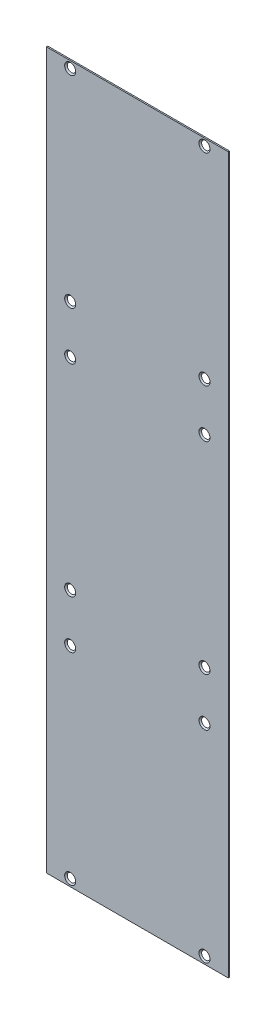
ISO-10303-21;
HEADER;
FILE_DESCRIPTION(('STEP AP214'),'2;1');
FILE_NAME('part.step','',(''),(''),'','','');
FILE_SCHEMA(('AUTOMOTIVE_DESIGN { 1 0 10303 214 1 1 1 1 }'));
ENDSEC;
DATA;
#1=APPLICATION_CONTEXT('core data for automotive mechanical design processes');
#2=APPLICATION_PROTOCOL_DEFINITION('international standard','automotive_design',2000,#1);
#3=PRODUCT_CONTEXT('',#1,'mechanical');
#4=PRODUCT('Part','Part','',(#3));
#5=PRODUCT_RELATED_PRODUCT_CATEGORY('part','',(#4));
#6=PRODUCT_DEFINITION_FORMATION('','',#4);
#7=PRODUCT_DEFINITION_CONTEXT('part definition',#1,'design');
#8=PRODUCT_DEFINITION('design','',#6,#7);
#9=PRODUCT_DEFINITION_SHAPE('','',#8);
#10=(LENGTH_UNIT() NAMED_UNIT(*) SI_UNIT(.MILLI.,.METRE.));
#11=(NAMED_UNIT(*) PLANE_ANGLE_UNIT() SI_UNIT($,.RADIAN.));
#12=(NAMED_UNIT(*) SI_UNIT($,.STERADIAN.) SOLID_ANGLE_UNIT());
#13=UNCERTAINTY_MEASURE_WITH_UNIT(LENGTH_MEASURE(1.E-05),#10,'distance_accuracy_value','');
#14=(GEOMETRIC_REPRESENTATION_CONTEXT(3) GLOBAL_UNCERTAINTY_ASSIGNED_CONTEXT((#13)) GLOBAL_UNIT_ASSIGNED_CONTEXT((#10,
#11,#12)) REPRESENTATION_CONTEXT('',''));
#15=CARTESIAN_POINT('',(0.,0.,0.));
#16=DIRECTION('',(0.,0.,1.));
#17=DIRECTION('',(1.,0.,0.));
#18=AXIS2_PLACEMENT_3D('',#15,#16,#17);
#19=CARTESIAN_POINT('',(0.,0.,0.6));
#20=DIRECTION('',(0.,0.,1.));
#21=DIRECTION('',(1.,0.,0.));
#22=AXIS2_PLACEMENT_3D('',#19,#20,#21);
#23=PLANE('',#22);
#24=CARTESIAN_POINT('',(-101.2,39.8,0.6));
#25=DIRECTION('',(0.,0.,1.));
#26=DIRECTION('',(1.,0.,0.));
#27=AXIS2_PLACEMENT_3D('',#24,#25,#26);
#28=CIRCLE('',#27,2.49996925638162);
#29=CARTESIAN_POINT('',(-98.7000307436184,39.8,0.6));
#30=VERTEX_POINT('',#29);
#31=EDGE_CURVE('E116',#30,#30,#28,.F.);
#32=ORIENTED_EDGE('',*,*,#31,.T.);
#33=EDGE_LOOP('',(#32));
#34=FACE_BOUND('',#33,.T.);
#35=CARTESIAN_POINT('',(-40.2,-187.2,0.6));
#36=DIRECTION('',(0.,0.,1.));
#37=DIRECTION('',(1.,0.,0.));
#38=AXIS2_PLACEMENT_3D('',#35,#36,#37);
#39=CIRCLE('',#38,2.49996925635706);
#40=CARTESIAN_POINT('',(-37.7000307436429,-187.2,0.6));
#41=VERTEX_POINT('',#40);
#42=EDGE_CURVE('E119',#41,#41,#39,.F.);
#43=ORIENTED_EDGE('',*,*,#42,.T.);
#44=EDGE_LOOP('',(#43));
#45=FACE_BOUND('',#44,.T.);
#46=CARTESIAN_POINT('',(-40.2,39.8,0.6));
#47=DIRECTION('',(0.,0.,1.));
#48=DIRECTION('',(1.,0.,0.));
#49=AXIS2_PLACEMENT_3D('',#46,#47,#48);
#50=CIRCLE('',#49,2.49996925638162);
#51=CARTESIAN_POINT('',(-37.7000307436184,39.8,0.6));
#52=VERTEX_POINT('',#51);
#53=EDGE_CURVE('E122',#52,#52,#50,.F.);
#54=ORIENTED_EDGE('',*,*,#53,.T.);
#55=EDGE_LOOP('',(#54));
#56=FACE_BOUND('',#55,.T.);
#57=CARTESIAN_POINT('',(-101.2,-278.8,0.6));
#58=DIRECTION('',(0.,0.,1.));
#59=DIRECTION('',(1.,0.,0.));
#60=AXIS2_PLACEMENT_3D('',#57,#58,#59);
#61=CIRCLE('',#60,2.49996925632834);
#62=CARTESIAN_POINT('',(-98.7000307436717,-278.8,0.6));
#63=VERTEX_POINT('',#62);
#64=EDGE_CURVE('E125',#63,#63,#61,.F.);
#65=ORIENTED_EDGE('',*,*,#64,.T.);
#66=EDGE_LOOP('',(#65));
#67=FACE_BOUND('',#66,.T.);
#68=CARTESIAN_POINT('',(-40.2,-278.8,0.6));
#69=DIRECTION('',(0.,0.,1.));
#70=DIRECTION('',(1.,0.,0.));
#71=AXIS2_PLACEMENT_3D('',#68,#69,#70);
#72=CIRCLE('',#71,2.49996925632834);
#73=CARTESIAN_POINT('',(-37.7000307436717,-278.8,0.6));
#74=VERTEX_POINT('',#73);
#75=EDGE_CURVE('E128',#74,#74,#72,.F.);
#76=ORIENTED_EDGE('',*,*,#75,.T.);
#77=EDGE_LOOP('',(#76));
#78=FACE_BOUND('',#77,.T.);
#79=CARTESIAN_POINT('',(-40.2,-51.8,0.6));
#80=DIRECTION('',(0.,0.,1.));
#81=DIRECTION('',(1.,0.,0.));
#82=AXIS2_PLACEMENT_3D('',#79,#80,#81);
#83=CIRCLE('',#82,2.49996925635288);
#84=CARTESIAN_POINT('',(-37.7000307436471,-51.8,0.6));
#85=VERTEX_POINT('',#84);
#86=EDGE_CURVE('E131',#85,#85,#83,.F.);
#87=ORIENTED_EDGE('',*,*,#86,.T.);
#88=EDGE_LOOP('',(#87));
#89=FACE_BOUND('',#88,.T.);
#90=CARTESIAN_POINT('',(-40.2,-165.3,0.6));
#91=DIRECTION('',(0.,0.,1.));
#92=DIRECTION('',(1.,0.,0.));
#93=AXIS2_PLACEMENT_3D('',#90,#91,#92);
#94=CIRCLE('',#93,2.49996925645429);
#95=CARTESIAN_POINT('',(-37.7000307435457,-165.3,0.6));
#96=VERTEX_POINT('',#95);
#97=EDGE_CURVE('E134',#96,#96,#94,.F.);
#98=ORIENTED_EDGE('',*,*,#97,.T.);
#99=EDGE_LOOP('',(#98));
#100=FACE_BOUND('',#99,.T.);
#101=CARTESIAN_POINT('',(-101.2,-51.8,0.6));
#102=DIRECTION('',(0.,0.,1.));
#103=DIRECTION('',(1.,0.,0.));
#104=AXIS2_PLACEMENT_3D('',#101,#102,#103);
#105=CIRCLE('',#104,2.49996925635288);
#106=CARTESIAN_POINT('',(-98.7000307436471,-51.8,0.6));
#107=VERTEX_POINT('',#106);
#108=EDGE_CURVE('E137',#107,#107,#105,.F.);
#109=ORIENTED_EDGE('',*,*,#108,.T.);
#110=EDGE_LOOP('',(#109));
#111=FACE_BOUND('',#110,.T.);
#112=CARTESIAN_POINT('',(-101.2,-73.7,0.6));
#113=DIRECTION('',(0.,0.,1.));
#114=DIRECTION('',(1.,0.,0.));
#115=AXIS2_PLACEMENT_3D('',#112,#113,#114);
#116=CIRCLE('',#115,2.49996925642619);
#117=CARTESIAN_POINT('',(-98.7000307435738,-73.7,0.6));
#118=VERTEX_POINT('',#117);
#119=EDGE_CURVE('E140',#118,#118,#116,.F.);
#120=ORIENTED_EDGE('',*,*,#119,.T.);
#121=EDGE_LOOP('',(#120));
#122=FACE_BOUND('',#121,.T.);
#123=CARTESIAN_POINT('',(-101.2,-165.3,0.6));
#124=DIRECTION('',(0.,0.,1.));
#125=DIRECTION('',(1.,0.,0.));
#126=AXIS2_PLACEMENT_3D('',#123,#124,#125);
#127=CIRCLE('',#126,2.49996925645429);
#128=CARTESIAN_POINT('',(-98.7000307435457,-165.3,0.6));
#129=VERTEX_POINT('',#128);
#130=EDGE_CURVE('E143',#129,#129,#127,.F.);
#131=ORIENTED_EDGE('',*,*,#130,.T.);
#132=EDGE_LOOP('',(#131));
#133=FACE_BOUND('',#132,.T.);
#134=CARTESIAN_POINT('',(-40.2,-73.7,0.6));
#135=DIRECTION('',(0.,0.,1.));
#136=DIRECTION('',(1.,0.,0.));
#137=AXIS2_PLACEMENT_3D('',#134,#135,#136);
#138=CIRCLE('',#137,2.49996925642619);
#139=CARTESIAN_POINT('',(-37.7000307435738,-73.7,0.6));
#140=VERTEX_POINT('',#139);
#141=EDGE_CURVE('E145',#140,#140,#138,.F.);
#142=ORIENTED_EDGE('',*,*,#141,.T.);
#143=EDGE_LOOP('',(#142));
#144=FACE_BOUND('',#143,.T.);
#145=CARTESIAN_POINT('',(-101.2,-187.2,0.6));
#146=DIRECTION('',(0.,0.,1.));
#147=DIRECTION('',(1.,0.,0.));
#148=AXIS2_PLACEMENT_3D('',#145,#146,#147);
#149=CIRCLE('',#148,2.49996925635706);
#150=CARTESIAN_POINT('',(-98.7000307436429,-187.2,0.6));
#151=VERTEX_POINT('',#150);
#152=EDGE_CURVE('E20',#151,#151,#149,.F.);
#153=ORIENTED_EDGE('',*,*,#152,.T.);
#154=EDGE_LOOP('',(#153));
#155=FACE_BOUND('',#154,.T.);
#156=DIRECTION('',(1.,0.,0.));
#157=VECTOR('',#156,1.);
#158=CARTESIAN_POINT('',(-112.,-282.,0.6));
#159=LINE('',#158,#157);
#160=CARTESIAN_POINT('',(-29.4,-282.,0.6));
#161=VERTEX_POINT('',#160);
#162=CARTESIAN_POINT('',(-112.,-282.,0.6));
#163=VERTEX_POINT('',#162);
#164=EDGE_CURVE('E71',#161,#163,#159,.F.);
#165=ORIENTED_EDGE('',*,*,#164,.F.);
#166=DIRECTION('',(0.,1.,0.));
#167=VECTOR('',#166,1.);
#168=CARTESIAN_POINT('',(-29.4,-282.,0.6));
#169=LINE('',#168,#167);
#170=CARTESIAN_POINT('',(-29.4,43.,0.6));
#171=VERTEX_POINT('',#170);
#172=EDGE_CURVE('E68',#171,#161,#169,.F.);
#173=ORIENTED_EDGE('',*,*,#172,.F.);
#174=DIRECTION('',(1.,0.,0.));
#175=VECTOR('',#174,1.);
#176=CARTESIAN_POINT('',(-29.4,43.,0.6));
#177=LINE('',#176,#175);
#178=CARTESIAN_POINT('',(-112.,43.,0.6));
#179=VERTEX_POINT('',#178);
#180=EDGE_CURVE('E59',#179,#171,#177,.T.);
#181=ORIENTED_EDGE('',*,*,#180,.F.);
#182=DIRECTION('',(0.,1.,0.));
#183=VECTOR('',#182,1.);
#184=CARTESIAN_POINT('',(-112.,43.,0.6));
#185=LINE('',#184,#183);
#186=EDGE_CURVE('E54',#163,#179,#185,.T.);
#187=ORIENTED_EDGE('',*,*,#186,.F.);
#188=EDGE_LOOP('',(#165,#173,#181,#187));
#189=FACE_BOUND('',#188,.T.);
#190=ADVANCED_FACE('F17',(#34,#45,#56,#67,#78,#89,#100,#111,#122,#133,#144,#155,#189),#23,.T.);
#191=CARTESIAN_POINT('',(-29.4,-282.,0.));
#192=DIRECTION('',(1.,0.,0.));
#193=DIRECTION('',(0.,0.,-1.));
#194=AXIS2_PLACEMENT_3D('',#191,#192,#193);
#195=PLANE('',#194);
#196=DIRECTION('',(0.,0.,-1.));
#197=VECTOR('',#196,1.);
#198=CARTESIAN_POINT('',(-29.4,-282.,0.));
#199=LINE('',#198,#197);
#200=CARTESIAN_POINT('',(-29.4,-282.,0.));
#201=VERTEX_POINT('',#200);
#202=EDGE_CURVE('E153',#201,#161,#199,.F.);
#203=ORIENTED_EDGE('',*,*,#202,.F.);
#204=DIRECTION('',(0.,1.,0.));
#205=VECTOR('',#204,1.);
#206=CARTESIAN_POINT('',(-29.4,0.,0.));
#207=LINE('',#206,#205);
#208=CARTESIAN_POINT('',(-29.4,43.,0.));
#209=VERTEX_POINT('',#208);
#210=EDGE_CURVE('E78',#201,#209,#207,.T.);
#211=ORIENTED_EDGE('',*,*,#210,.T.);
#212=DIRECTION('',(0.,0.,1.));
#213=VECTOR('',#212,1.);
#214=CARTESIAN_POINT('',(-29.4,43.,0.));
#215=LINE('',#214,#213);
#216=EDGE_CURVE('E64',#171,#209,#215,.F.);
#217=ORIENTED_EDGE('',*,*,#216,.F.);
#218=ORIENTED_EDGE('',*,*,#172,.T.);
#219=EDGE_LOOP('',(#203,#211,#217,#218));
#220=FACE_BOUND('',#219,.T.);
#221=ADVANCED_FACE('F77',(#220),#195,.T.);
#222=CARTESIAN_POINT('',(-29.4,43.,0.));
#223=DIRECTION('',(0.,1.,0.));
#224=DIRECTION('',(0.,0.,1.));
#225=AXIS2_PLACEMENT_3D('',#222,#223,#224);
#226=PLANE('',#225);
#227=ORIENTED_EDGE('',*,*,#216,.T.);
#228=DIRECTION('',(1.,0.,0.));
#229=VECTOR('',#228,1.);
#230=CARTESIAN_POINT('',(0.,43.,0.));
#231=LINE('',#230,#229);
#232=CARTESIAN_POINT('',(-112.,43.,0.));
#233=VERTEX_POINT('',#232);
#234=EDGE_CURVE('E164',#209,#233,#231,.F.);
#235=ORIENTED_EDGE('',*,*,#234,.T.);
#236=DIRECTION('',(0.,0.,1.));
#237=VECTOR('',#236,1.);
#238=CARTESIAN_POINT('',(-112.,43.,0.));
#239=LINE('',#238,#237);
#240=EDGE_CURVE('E66',#179,#233,#239,.F.);
#241=ORIENTED_EDGE('',*,*,#240,.F.);
#242=ORIENTED_EDGE('',*,*,#180,.T.);
#243=EDGE_LOOP('',(#227,#235,#241,#242));
#244=FACE_BOUND('',#243,.T.);
#245=ADVANCED_FACE('F61',(#244),#226,.T.);
#246=CARTESIAN_POINT('',(-112.,43.,0.));
#247=DIRECTION('',(-1.,0.,0.));
#248=DIRECTION('',(0.,0.,1.));
#249=AXIS2_PLACEMENT_3D('',#246,#247,#248);
#250=PLANE('',#249);
#251=ORIENTED_EDGE('',*,*,#240,.T.);
#252=DIRECTION('',(0.,1.,0.));
#253=VECTOR('',#252,1.);
#254=CARTESIAN_POINT('',(-112.,0.,0.));
#255=LINE('',#254,#253);
#256=CARTESIAN_POINT('',(-112.,-282.,0.));
#257=VERTEX_POINT('',#256);
#258=EDGE_CURVE('E161',#233,#257,#255,.F.);
#259=ORIENTED_EDGE('',*,*,#258,.T.);
#260=DIRECTION('',(0.,0.,-1.));
#261=VECTOR('',#260,1.);
#262=CARTESIAN_POINT('',(-112.,-282.,0.));
#263=LINE('',#262,#261);
#264=EDGE_CURVE('E35',#163,#257,#263,.T.);
#265=ORIENTED_EDGE('',*,*,#264,.F.);
#266=ORIENTED_EDGE('',*,*,#186,.T.);
#267=EDGE_LOOP('',(#251,#259,#265,#266));
#268=FACE_BOUND('',#267,.T.);
#269=ADVANCED_FACE('F160',(#268),#250,.T.);
#270=CARTESIAN_POINT('',(-112.,-282.,0.));
#271=DIRECTION('',(0.,-1.,0.));
#272=DIRECTION('',(0.,0.,-1.));
#273=AXIS2_PLACEMENT_3D('',#270,#271,#272);
#274=PLANE('',#273);
#275=ORIENTED_EDGE('',*,*,#264,.T.);
#276=DIRECTION('',(1.,0.,0.));
#277=VECTOR('',#276,1.);
#278=CARTESIAN_POINT('',(0.,-282.,0.));
#279=LINE('',#278,#277);
#280=EDGE_CURVE('E115',#257,#201,#279,.T.);
#281=ORIENTED_EDGE('',*,*,#280,.T.);
#282=ORIENTED_EDGE('',*,*,#202,.T.);
#283=ORIENTED_EDGE('',*,*,#164,.T.);
#284=EDGE_LOOP('',(#275,#281,#282,#283));
#285=FACE_BOUND('',#284,.T.);
#286=ADVANCED_FACE('F167',(#285),#274,.T.);
#287=CARTESIAN_POINT('',(-101.2,-187.2,0.600010074265356));
#288=DIRECTION('',(0.,0.,1.));
#289=DIRECTION('',(1.,0.,0.));
#290=AXIS2_PLACEMENT_3D('',#287,#288,#289);
#291=CONICAL_SURFACE('',#290,2.49997933049853,0.785392014615525);
#292=CARTESIAN_POINT('',(-101.2,-187.2,0.));
#293=DIRECTION('',(0.,0.,1.));
#294=DIRECTION('',(1.,0.,0.));
#295=AXIS2_PLACEMENT_3D('',#292,#293,#294);
#296=CIRCLE('',#295,1.89997663485);
#297=CARTESIAN_POINT('',(-99.30002336515,-187.2,0.));
#298=VERTEX_POINT('',#297);
#299=EDGE_CURVE('E112',#298,#298,#296,.F.);
#300=ORIENTED_EDGE('',*,*,#299,.T.);
#301=EDGE_LOOP('',(#300));
#302=FACE_BOUND('',#301,.T.);
#303=ORIENTED_EDGE('',*,*,#152,.F.);
#304=EDGE_LOOP('',(#303));
#305=FACE_BOUND('',#304,.T.);
#306=ADVANCED_FACE('F169',(#302,#305),#291,.F.);
#307=CARTESIAN_POINT('',(-40.2,-73.7,0.600010074151669));
#308=DIRECTION('',(0.,0.,1.));
#309=DIRECTION('',(1.,0.,0.));
#310=AXIS2_PLACEMENT_3D('',#307,#308,#309);
#311=CONICAL_SURFACE('',#310,2.49997933045397,0.785392014662892);
#312=CARTESIAN_POINT('',(-40.2,-73.7,0.));
#313=DIRECTION('',(0.,0.,1.));
#314=DIRECTION('',(1.,0.,0.));
#315=AXIS2_PLACEMENT_3D('',#312,#313,#314);
#316=CIRCLE('',#315,1.89997663486229);
#317=CARTESIAN_POINT('',(-38.3000233651377,-73.7,0.));
#318=VERTEX_POINT('',#317);
#319=EDGE_CURVE('E109',#318,#318,#316,.F.);
#320=ORIENTED_EDGE('',*,*,#319,.T.);
#321=EDGE_LOOP('',(#320));
#322=FACE_BOUND('',#321,.T.);
#323=ORIENTED_EDGE('',*,*,#141,.F.);
#324=EDGE_LOOP('',(#323));
#325=FACE_BOUND('',#324,.T.);
#326=ADVANCED_FACE('F176',(#322,#325),#311,.F.);
#327=CARTESIAN_POINT('',(-101.2,-165.3,0.600010074151669));
#328=DIRECTION('',(0.,0.,1.));
#329=DIRECTION('',(1.,0.,0.));
#330=AXIS2_PLACEMENT_3D('',#327,#328,#329);
#331=CONICAL_SURFACE('',#330,2.49997933048207,0.785392014662892);
#332=CARTESIAN_POINT('',(-101.2,-165.3,0.));
#333=DIRECTION('',(0.,0.,1.));
#334=DIRECTION('',(1.,0.,0.));
#335=AXIS2_PLACEMENT_3D('',#332,#333,#334);
#336=CIRCLE('',#335,1.89997663489039);
#337=CARTESIAN_POINT('',(-99.3000233651096,-165.3,0.));
#338=VERTEX_POINT('',#337);
#339=EDGE_CURVE('E106',#338,#338,#336,.F.);
#340=ORIENTED_EDGE('',*,*,#339,.T.);
#341=EDGE_LOOP('',(#340));
#342=FACE_BOUND('',#341,.T.);
#343=ORIENTED_EDGE('',*,*,#130,.F.);
#344=EDGE_LOOP('',(#343));
#345=FACE_BOUND('',#344,.T.);
#346=ADVANCED_FACE('F223',(#342,#345),#331,.F.);
#347=CARTESIAN_POINT('',(-101.2,-73.7,0.600010074151669));
#348=DIRECTION('',(0.,0.,1.));
#349=DIRECTION('',(1.,0.,0.));
#350=AXIS2_PLACEMENT_3D('',#347,#348,#349);
#351=CONICAL_SURFACE('',#350,2.49997933045397,0.785392014662892);
#352=CARTESIAN_POINT('',(-101.2,-73.7,0.));
#353=DIRECTION('',(0.,0.,1.));
#354=DIRECTION('',(1.,0.,0.));
#355=AXIS2_PLACEMENT_3D('',#352,#353,#354);
#356=CIRCLE('',#355,1.89997663486229);
#357=CARTESIAN_POINT('',(-99.3000233651377,-73.7,0.));
#358=VERTEX_POINT('',#357);
#359=EDGE_CURVE('E103',#358,#358,#356,.F.);
#360=ORIENTED_EDGE('',*,*,#359,.T.);
#361=EDGE_LOOP('',(#360));
#362=FACE_BOUND('',#361,.T.);
#363=ORIENTED_EDGE('',*,*,#119,.F.);
#364=EDGE_LOOP('',(#363));
#365=FACE_BOUND('',#364,.T.);
#366=ADVANCED_FACE('F219',(#362,#365),#351,.F.);
#367=CARTESIAN_POINT('',(-101.2,-51.8,0.600010074151669));
#368=DIRECTION('',(0.,0.,1.));
#369=DIRECTION('',(1.,0.,0.));
#370=AXIS2_PLACEMENT_3D('',#367,#368,#369);
#371=CONICAL_SURFACE('',#370,2.49997933038067,0.785392014662892);
#372=CARTESIAN_POINT('',(-101.2,-51.8,0.));
#373=DIRECTION('',(0.,0.,1.));
#374=DIRECTION('',(1.,0.,0.));
#375=AXIS2_PLACEMENT_3D('',#372,#373,#374);
#376=CIRCLE('',#375,1.89997663478898);
#377=CARTESIAN_POINT('',(-99.300023365211,-51.8,0.));
#378=VERTEX_POINT('',#377);
#379=EDGE_CURVE('E100',#378,#378,#376,.F.);
#380=ORIENTED_EDGE('',*,*,#379,.T.);
#381=EDGE_LOOP('',(#380));
#382=FACE_BOUND('',#381,.T.);
#383=ORIENTED_EDGE('',*,*,#108,.F.);
#384=EDGE_LOOP('',(#383));
#385=FACE_BOUND('',#384,.T.);
#386=ADVANCED_FACE('F215',(#382,#385),#371,.F.);
#387=CARTESIAN_POINT('',(-40.2,-165.3,0.600010074151669));
#388=DIRECTION('',(0.,0.,1.));
#389=DIRECTION('',(1.,0.,0.));
#390=AXIS2_PLACEMENT_3D('',#387,#388,#389);
#391=CONICAL_SURFACE('',#390,2.49997933048207,0.785392014662892);
#392=CARTESIAN_POINT('',(-40.2,-165.3,0.));
#393=DIRECTION('',(0.,0.,1.));
#394=DIRECTION('',(1.,0.,0.));
#395=AXIS2_PLACEMENT_3D('',#392,#393,#394);
#396=CIRCLE('',#395,1.89997663489039);
#397=CARTESIAN_POINT('',(-38.3000233651096,-165.3,0.));
#398=VERTEX_POINT('',#397);
#399=EDGE_CURVE('E97',#398,#398,#396,.F.);
#400=ORIENTED_EDGE('',*,*,#399,.T.);
#401=EDGE_LOOP('',(#400));
#402=FACE_BOUND('',#401,.T.);
#403=ORIENTED_EDGE('',*,*,#97,.F.);
#404=EDGE_LOOP('',(#403));
#405=FACE_BOUND('',#404,.T.);
#406=ADVANCED_FACE('F211',(#402,#405),#391,.F.);
#407=CARTESIAN_POINT('',(-40.2,-51.8,0.600010074151669));
#408=DIRECTION('',(0.,0.,1.));
#409=DIRECTION('',(1.,0.,0.));
#410=AXIS2_PLACEMENT_3D('',#407,#408,#409);
#411=CONICAL_SURFACE('',#410,2.49997933038067,0.785392014662892);
#412=CARTESIAN_POINT('',(-40.2,-51.8,0.));
#413=DIRECTION('',(0.,0.,1.));
#414=DIRECTION('',(1.,0.,0.));
#415=AXIS2_PLACEMENT_3D('',#412,#413,#414);
#416=CIRCLE('',#415,1.89997663478898);
#417=CARTESIAN_POINT('',(-38.300023365211,-51.8,0.));
#418=VERTEX_POINT('',#417);
#419=EDGE_CURVE('E94',#418,#418,#416,.F.);
#420=ORIENTED_EDGE('',*,*,#419,.T.);
#421=EDGE_LOOP('',(#420));
#422=FACE_BOUND('',#421,.T.);
#423=ORIENTED_EDGE('',*,*,#86,.F.);
#424=EDGE_LOOP('',(#423));
#425=FACE_BOUND('',#424,.T.);
#426=ADVANCED_FACE('F207',(#422,#425),#411,.F.);
#427=CARTESIAN_POINT('',(-40.2,-278.8,0.600010074265356));
#428=DIRECTION('',(0.,0.,1.));
#429=DIRECTION('',(1.,0.,0.));
#430=AXIS2_PLACEMENT_3D('',#427,#428,#429);
#431=CONICAL_SURFACE('',#430,2.4999793304698,0.785392014615523);
#432=CARTESIAN_POINT('',(-40.2,-278.8,5.6843418860808E-11));
#433=DIRECTION('',(0.,0.,1.));
#434=DIRECTION('',(1.,0.,0.));
#435=AXIS2_PLACEMENT_3D('',#432,#433,#434);
#436=CIRCLE('',#435,1.89997663487812);
#437=CARTESIAN_POINT('',(-38.3000233651219,-278.8,5.6843418860808E-11));
#438=VERTEX_POINT('',#437);
#439=EDGE_CURVE('E91',#438,#438,#436,.F.);
#440=ORIENTED_EDGE('',*,*,#439,.T.);
#441=EDGE_LOOP('',(#440));
#442=FACE_BOUND('',#441,.T.);
#443=ORIENTED_EDGE('',*,*,#75,.F.);
#444=EDGE_LOOP('',(#443));
#445=FACE_BOUND('',#444,.T.);
#446=ADVANCED_FACE('F203',(#442,#445),#431,.F.);
#447=CARTESIAN_POINT('',(-101.2,-278.8,0.600010074265356));
#448=DIRECTION('',(0.,0.,1.));
#449=DIRECTION('',(1.,0.,0.));
#450=AXIS2_PLACEMENT_3D('',#447,#448,#449);
#451=CONICAL_SURFACE('',#450,2.4999793304698,0.785392014615525);
#452=CARTESIAN_POINT('',(-101.2,-278.8,5.6843418860808E-11));
#453=DIRECTION('',(0.,0.,1.));
#454=DIRECTION('',(1.,0.,0.));
#455=AXIS2_PLACEMENT_3D('',#452,#453,#454);
#456=CIRCLE('',#455,1.89997663487812);
#457=CARTESIAN_POINT('',(-99.3000233651219,-278.8,5.6843418860808E-11));
#458=VERTEX_POINT('',#457);
#459=EDGE_CURVE('E88',#458,#458,#456,.F.);
#460=ORIENTED_EDGE('',*,*,#459,.T.);
#461=EDGE_LOOP('',(#460));
#462=FACE_BOUND('',#461,.T.);
#463=ORIENTED_EDGE('',*,*,#64,.F.);
#464=EDGE_LOOP('',(#463));
#465=FACE_BOUND('',#464,.T.);
#466=ADVANCED_FACE('F199',(#462,#465),#451,.F.);
#467=CARTESIAN_POINT('',(-40.2,39.8,0.600010074151669));
#468=DIRECTION('',(0.,0.,1.));
#469=DIRECTION('',(1.,0.,0.));
#470=AXIS2_PLACEMENT_3D('',#467,#468,#469);
#471=CONICAL_SURFACE('',#470,2.4999793304094,0.785392014662892);
#472=CARTESIAN_POINT('',(-40.2,39.8,0.));
#473=DIRECTION('',(0.,0.,1.));
#474=DIRECTION('',(1.,0.,0.));
#475=AXIS2_PLACEMENT_3D('',#472,#473,#474);
#476=CIRCLE('',#475,1.89997663481772);
#477=CARTESIAN_POINT('',(-38.3000233651823,39.8,0.));
#478=VERTEX_POINT('',#477);
#479=EDGE_CURVE('E85',#478,#478,#476,.F.);
#480=ORIENTED_EDGE('',*,*,#479,.T.);
#481=EDGE_LOOP('',(#480));
#482=FACE_BOUND('',#481,.T.);
#483=ORIENTED_EDGE('',*,*,#53,.F.);
#484=EDGE_LOOP('',(#483));
#485=FACE_BOUND('',#484,.T.);
#486=ADVANCED_FACE('F195',(#482,#485),#471,.F.);
#487=CARTESIAN_POINT('',(-40.2,-187.2,0.600010074265356));
#488=DIRECTION('',(0.,0.,1.));
#489=DIRECTION('',(1.,0.,0.));
#490=AXIS2_PLACEMENT_3D('',#487,#488,#489);
#491=CONICAL_SURFACE('',#490,2.49997933049853,0.785392014615525);
#492=CARTESIAN_POINT('',(-40.2,-187.2,0.));
#493=DIRECTION('',(0.,0.,1.));
#494=DIRECTION('',(1.,0.,0.));
#495=AXIS2_PLACEMENT_3D('',#492,#493,#494);
#496=CIRCLE('',#495,1.89997663485);
#497=CARTESIAN_POINT('',(-38.30002336515,-187.2,0.));
#498=VERTEX_POINT('',#497);
#499=EDGE_CURVE('E26',#498,#498,#496,.F.);
#500=ORIENTED_EDGE('',*,*,#499,.T.);
#501=EDGE_LOOP('',(#500));
#502=FACE_BOUND('',#501,.T.);
#503=ORIENTED_EDGE('',*,*,#42,.F.);
#504=EDGE_LOOP('',(#503));
#505=FACE_BOUND('',#504,.T.);
#506=ADVANCED_FACE('F187',(#502,#505),#491,.F.);
#507=CARTESIAN_POINT('',(-101.2,39.8,0.600010074151669));
#508=DIRECTION('',(0.,0.,1.));
#509=DIRECTION('',(1.,0.,0.));
#510=AXIS2_PLACEMENT_3D('',#507,#508,#509);
#511=CONICAL_SURFACE('',#510,2.4999793304094,0.785392014662892);
#512=CARTESIAN_POINT('',(-101.2,39.8,0.));
#513=DIRECTION('',(0.,0.,1.));
#514=DIRECTION('',(1.,0.,0.));
#515=AXIS2_PLACEMENT_3D('',#512,#513,#514);
#516=CIRCLE('',#515,1.89997663481772);
#517=CARTESIAN_POINT('',(-99.3000233651823,39.8,0.));
#518=VERTEX_POINT('',#517);
#519=EDGE_CURVE('E11',#518,#518,#516,.F.);
#520=ORIENTED_EDGE('',*,*,#519,.T.);
#521=EDGE_LOOP('',(#520));
#522=FACE_BOUND('',#521,.T.);
#523=ORIENTED_EDGE('',*,*,#31,.F.);
#524=EDGE_LOOP('',(#523));
#525=FACE_BOUND('',#524,.T.);
#526=ADVANCED_FACE('F181',(#522,#525),#511,.F.);
#527=CARTESIAN_POINT('',(0.,0.,0.));
#528=DIRECTION('',(0.,0.,1.));
#529=DIRECTION('',(1.,0.,0.));
#530=AXIS2_PLACEMENT_3D('',#527,#528,#529);
#531=PLANE('',#530);
#532=ORIENTED_EDGE('',*,*,#519,.F.);
#533=EDGE_LOOP('',(#532));
#534=FACE_BOUND('',#533,.T.);
#535=ORIENTED_EDGE('',*,*,#499,.F.);
#536=EDGE_LOOP('',(#535));
#537=FACE_BOUND('',#536,.T.);
#538=ORIENTED_EDGE('',*,*,#479,.F.);
#539=EDGE_LOOP('',(#538));
#540=FACE_BOUND('',#539,.T.);
#541=ORIENTED_EDGE('',*,*,#459,.F.);
#542=EDGE_LOOP('',(#541));
#543=FACE_BOUND('',#542,.T.);
#544=ORIENTED_EDGE('',*,*,#439,.F.);
#545=EDGE_LOOP('',(#544));
#546=FACE_BOUND('',#545,.T.);
#547=ORIENTED_EDGE('',*,*,#419,.F.);
#548=EDGE_LOOP('',(#547));
#549=FACE_BOUND('',#548,.T.);
#550=ORIENTED_EDGE('',*,*,#399,.F.);
#551=EDGE_LOOP('',(#550));
#552=FACE_BOUND('',#551,.T.);
#553=ORIENTED_EDGE('',*,*,#379,.F.);
#554=EDGE_LOOP('',(#553));
#555=FACE_BOUND('',#554,.T.);
#556=ORIENTED_EDGE('',*,*,#359,.F.);
#557=EDGE_LOOP('',(#556));
#558=FACE_BOUND('',#557,.T.);
#559=ORIENTED_EDGE('',*,*,#339,.F.);
#560=EDGE_LOOP('',(#559));
#561=FACE_BOUND('',#560,.T.);
#562=ORIENTED_EDGE('',*,*,#319,.F.);
#563=EDGE_LOOP('',(#562));
#564=FACE_BOUND('',#563,.T.);
#565=ORIENTED_EDGE('',*,*,#299,.F.);
#566=EDGE_LOOP('',(#565));
#567=FACE_BOUND('',#566,.T.);
#568=ORIENTED_EDGE('',*,*,#258,.F.);
#569=ORIENTED_EDGE('',*,*,#234,.F.);
#570=ORIENTED_EDGE('',*,*,#210,.F.);
#571=ORIENTED_EDGE('',*,*,#280,.F.);
#572=EDGE_LOOP('',(#568,#569,#570,#571));
#573=FACE_BOUND('',#572,.T.);
#574=ADVANCED_FACE('F163',(#534,#537,#540,#543,#546,#549,#552,#555,#558,#561,#564,#567,#573),
#531,.F.);
#575=CLOSED_SHELL('',(#190,#221,#245,#269,#286,#306,#326,#346,#366,#386,#406,#426,#446,#466,
#486,#506,#526,#574));
#576=MANIFOLD_SOLID_BREP('B1',#575);
#577=ADVANCED_BREP_SHAPE_REPRESENTATION('',(#18,#576),#14);
#578=SHAPE_DEFINITION_REPRESENTATION(#9,#577);
ENDSEC;
END-ISO-10303-21;
